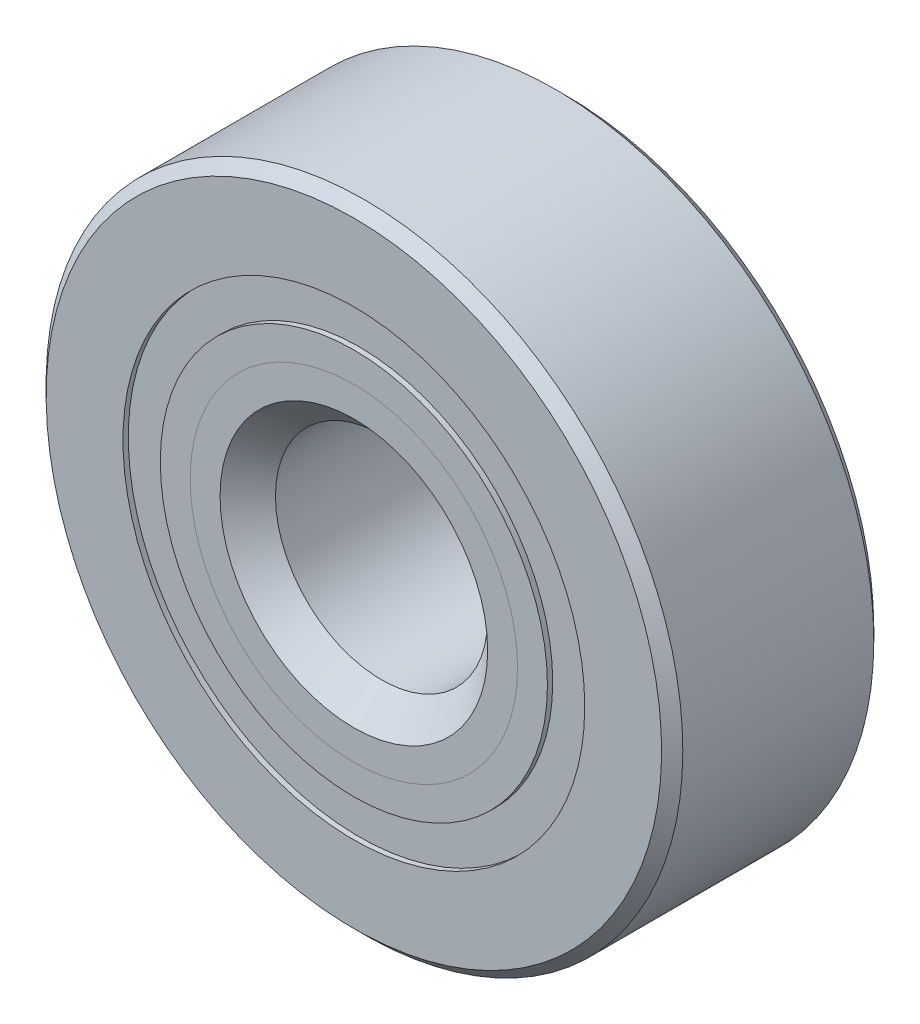
ISO-10303-21;
HEADER;
FILE_DESCRIPTION(('STEP AP214'),'2;1');
FILE_NAME('part.step','',(''),(''),'','','');
FILE_SCHEMA(('AUTOMOTIVE_DESIGN { 1 0 10303 214 1 1 1 1 }'));
ENDSEC;
DATA;
#1=APPLICATION_CONTEXT('core data for automotive mechanical design processes');
#2=APPLICATION_PROTOCOL_DEFINITION('international standard','automotive_design',2000,#1);
#3=PRODUCT_CONTEXT('',#1,'mechanical');
#4=PRODUCT('Part','Part','',(#3));
#5=PRODUCT_RELATED_PRODUCT_CATEGORY('part','',(#4));
#6=PRODUCT_DEFINITION_FORMATION('','',#4);
#7=PRODUCT_DEFINITION_CONTEXT('part definition',#1,'design');
#8=PRODUCT_DEFINITION('design','',#6,#7);
#9=PRODUCT_DEFINITION_SHAPE('','',#8);
#10=(LENGTH_UNIT() NAMED_UNIT(*) SI_UNIT(.MILLI.,.METRE.));
#11=(NAMED_UNIT(*) PLANE_ANGLE_UNIT() SI_UNIT($,.RADIAN.));
#12=(NAMED_UNIT(*) SI_UNIT($,.STERADIAN.) SOLID_ANGLE_UNIT());
#13=UNCERTAINTY_MEASURE_WITH_UNIT(LENGTH_MEASURE(1.E-05),#10,'distance_accuracy_value','');
#14=(GEOMETRIC_REPRESENTATION_CONTEXT(3) GLOBAL_UNCERTAINTY_ASSIGNED_CONTEXT((#13)) GLOBAL_UNIT_ASSIGNED_CONTEXT((#10,
#11,#12)) REPRESENTATION_CONTEXT('',''));
#15=CARTESIAN_POINT('',(0.,0.,0.));
#16=DIRECTION('',(0.,0.,1.));
#17=DIRECTION('',(1.,0.,0.));
#18=AXIS2_PLACEMENT_3D('',#15,#16,#17);
#19=CARTESIAN_POINT('',(0.,-9.525,0.));
#20=DIRECTION('',(0.,-1.,0.));
#21=DIRECTION('',(0.,0.,1.));
#22=AXIS2_PLACEMENT_3D('',#19,#20,#21);
#23=SPHERICAL_SURFACE('',#22,2.27628073054021);
#24=CARTESIAN_POINT('',(0.,-11.8012807305402,0.));
#25=VERTEX_POINT('',#24);
#26=VERTEX_LOOP('',#25);
#27=FACE_BOUND('',#26,.T.);
#28=ADVANCED_FACE('P0_F13',(#27),#23,.T.);
#29=CLOSED_SHELL('',(#28));
#30=MANIFOLD_SOLID_BREP('P0_B1',#29);
#31=CARTESIAN_POINT('',(-8.24889197104682,-4.76249999999992,0.));
#32=DIRECTION('',(-0.866025403784443,-0.499999999999992,0.));
#33=DIRECTION('',(0.,0.,1.));
#34=AXIS2_PLACEMENT_3D('',#31,#32,#33);
#35=SPHERICAL_SURFACE('',#34,2.27628073054022);
#36=CARTESIAN_POINT('',(-10.2202089098397,-5.90064036527001,0.));
#37=VERTEX_POINT('',#36);
#38=VERTEX_LOOP('',#37);
#39=FACE_BOUND('',#38,.T.);
#40=ADVANCED_FACE('P1_F13',(#39),#35,.T.);
#41=CLOSED_SHELL('',(#40));
#42=MANIFOLD_SOLID_BREP('P1_B1',#41);
#43=CARTESIAN_POINT('',(-9.525,0.,0.));
#44=DIRECTION('',(-1.,0.,0.));
#45=DIRECTION('',(0.,0.,-1.));
#46=AXIS2_PLACEMENT_3D('',#43,#44,#45);
#47=SPHERICAL_SURFACE('',#46,2.27628073054021);
#48=CARTESIAN_POINT('',(-11.8012807305402,1.23621584838382E-13,0.));
#49=VERTEX_POINT('',#48);
#50=VERTEX_LOOP('',#49);
#51=FACE_BOUND('',#50,.T.);
#52=ADVANCED_FACE('P2_F13',(#51),#47,.T.);
#53=CLOSED_SHELL('',(#52));
#54=MANIFOLD_SOLID_BREP('P2_B1',#53);
#55=CARTESIAN_POINT('',(0.,0.,4.7625));
#56=DIRECTION('',(0.,0.,1.));
#57=DIRECTION('',(1.,0.,0.));
#58=AXIS2_PLACEMENT_3D('',#55,#56,#57);
#59=CYLINDRICAL_SURFACE('',#58,6.00560963472989);
#60=CARTESIAN_POINT('',(0.,0.,0.));
#61=DIRECTION('',(0.,0.,1.));
#62=DIRECTION('',(1.,0.,0.));
#63=AXIS2_PLACEMENT_3D('',#60,#61,#62);
#64=CIRCLE('',#63,6.00560963472989);
#65=CARTESIAN_POINT('',(6.00560963472989,0.,0.));
#66=VERTEX_POINT('',#65);
#67=EDGE_CURVE('P3_E19',#66,#66,#64,.F.);
#68=ORIENTED_EDGE('',*,*,#67,.T.);
#69=EDGE_LOOP('',(#68));
#70=FACE_BOUND('',#69,.T.);
#71=CARTESIAN_POINT('',(0.,0.,3.42148613604627));
#72=DIRECTION('',(0.,0.,1.));
#73=DIRECTION('',(1.,0.,0.));
#74=AXIS2_PLACEMENT_3D('',#71,#72,#73);
#75=CIRCLE('',#74,6.00560963472989);
#76=CARTESIAN_POINT('',(6.00560963472989,0.,3.42148613604627));
#77=VERTEX_POINT('',#76);
#78=EDGE_CURVE('P3_E32',#77,#77,#75,.T.);
#79=ORIENTED_EDGE('',*,*,#78,.T.);
#80=EDGE_LOOP('',(#79));
#81=FACE_BOUND('',#80,.T.);
#82=ADVANCED_FACE('P3_F15',(#70,#81),#59,.F.);
#83=CARTESIAN_POINT('',(0.,6.00560963472989,0.));
#84=DIRECTION('',(0.,0.,1.));
#85=DIRECTION('',(1.,0.,0.));
#86=AXIS2_PLACEMENT_3D('',#83,#84,#85);
#87=PLANE('',#86);
#88=CARTESIAN_POINT('',(0.,0.,0.));
#89=DIRECTION('',(0.,0.,1.));
#90=DIRECTION('',(1.,0.,0.));
#91=AXIS2_PLACEMENT_3D('',#88,#89,#90);
#92=CIRCLE('',#91,7.24871926945979);
#93=CARTESIAN_POINT('',(7.24871926945979,0.,0.));
#94=VERTEX_POINT('',#93);
#95=EDGE_CURVE('P3_E34',#94,#94,#92,.F.);
#96=ORIENTED_EDGE('',*,*,#95,.T.);
#97=EDGE_LOOP('',(#96));
#98=FACE_BOUND('',#97,.T.);
#99=ORIENTED_EDGE('',*,*,#67,.F.);
#100=EDGE_LOOP('',(#99));
#101=FACE_BOUND('',#100,.T.);
#102=ADVANCED_FACE('P3_F45',(#98,#101),#87,.F.);
#103=CARTESIAN_POINT('',(0.,0.,4.7625));
#104=DIRECTION('',(0.,0.,1.));
#105=DIRECTION('',(1.,0.,0.));
#106=AXIS2_PLACEMENT_3D('',#103,#104,#105);
#107=CONICAL_SURFACE('',#106,7.34662349868363,0.78539816339745);
#108=ORIENTED_EDGE('',*,*,#78,.F.);
#109=EDGE_LOOP('',(#108));
#110=FACE_BOUND('',#109,.T.);
#111=CARTESIAN_POINT('',(0.,0.,4.7625));
#112=DIRECTION('',(0.,0.,1.));
#113=DIRECTION('',(1.,0.,0.));
#114=AXIS2_PLACEMENT_3D('',#111,#112,#113);
#115=CIRCLE('',#114,7.34662349868363);
#116=CARTESIAN_POINT('',(7.34662349868363,0.,4.7625));
#117=VERTEX_POINT('',#116);
#118=EDGE_CURVE('P3_E28',#117,#117,#115,.T.);
#119=ORIENTED_EDGE('',*,*,#118,.T.);
#120=EDGE_LOOP('',(#119));
#121=FACE_BOUND('',#120,.T.);
#122=ADVANCED_FACE('P3_F47',(#110,#121),#107,.F.);
#123=CARTESIAN_POINT('',(0.,0.,0.));
#124=DIRECTION('',(0.,0.,1.));
#125=DIRECTION('',(1.,0.,0.));
#126=AXIS2_PLACEMENT_3D('',#123,#124,#125);
#127=TOROIDAL_SURFACE('',#126,9.525,2.27628073054021);
#128=CARTESIAN_POINT('',(0.,0.,2.11666666666667));
#129=DIRECTION('',(0.,0.,1.));
#130=DIRECTION('',(1.,0.,0.));
#131=AXIS2_PLACEMENT_3D('',#128,#129,#130);
#132=CIRCLE('',#131,8.68763736263736);
#133=CARTESIAN_POINT('',(8.68763736263736,0.,2.11666666666667));
#134=VERTEX_POINT('',#133);
#135=EDGE_CURVE('P3_E23',#134,#134,#132,.T.);
#136=ORIENTED_EDGE('',*,*,#135,.F.);
#137=EDGE_LOOP('',(#136));
#138=FACE_BOUND('',#137,.T.);
#139=ORIENTED_EDGE('',*,*,#95,.F.);
#140=EDGE_LOOP('',(#139));
#141=FACE_BOUND('',#140,.T.);
#142=ADVANCED_FACE('P3_F17',(#138,#141),#127,.F.);
#143=CARTESIAN_POINT('',(0.,8.68763736263736,4.7625));
#144=DIRECTION('',(0.,0.,-1.));
#145=DIRECTION('',(-1.,0.,0.));
#146=AXIS2_PLACEMENT_3D('',#143,#144,#145);
#147=PLANE('',#146);
#148=ORIENTED_EDGE('',*,*,#118,.F.);
#149=EDGE_LOOP('',(#148));
#150=FACE_BOUND('',#149,.T.);
#151=CARTESIAN_POINT('',(0.,0.,4.7625));
#152=DIRECTION('',(0.,0.,1.));
#153=DIRECTION('',(1.,0.,0.));
#154=AXIS2_PLACEMENT_3D('',#151,#152,#153);
#155=CIRCLE('',#154,8.68763736263736);
#156=CARTESIAN_POINT('',(8.68763736263736,0.,4.7625));
#157=VERTEX_POINT('',#156);
#158=EDGE_CURVE('P3_E10',#157,#157,#155,.F.);
#159=ORIENTED_EDGE('',*,*,#158,.F.);
#160=EDGE_LOOP('',(#159));
#161=FACE_BOUND('',#160,.T.);
#162=ADVANCED_FACE('P3_F58',(#150,#161),#147,.F.);
#163=CARTESIAN_POINT('',(0.,0.,4.7625));
#164=DIRECTION('',(0.,0.,1.));
#165=DIRECTION('',(1.,0.,0.));
#166=AXIS2_PLACEMENT_3D('',#163,#164,#165);
#167=CYLINDRICAL_SURFACE('',#166,8.68763736263736);
#168=ORIENTED_EDGE('',*,*,#158,.T.);
#169=EDGE_LOOP('',(#168));
#170=FACE_BOUND('',#169,.T.);
#171=ORIENTED_EDGE('',*,*,#135,.T.);
#172=EDGE_LOOP('',(#171));
#173=FACE_BOUND('',#172,.T.);
#174=ADVANCED_FACE('P3_F56',(#170,#173),#167,.T.);
#175=CLOSED_SHELL('',(#82,#102,#122,#142,#162,#174));
#176=MANIFOLD_SOLID_BREP('P3_B1',#175);
#177=CARTESIAN_POINT('',(0.,0.,0.));
#178=DIRECTION('',(0.,0.,1.));
#179=DIRECTION('',(0.,-1.,0.));
#180=AXIS2_PLACEMENT_3D('',#177,#178,#179);
#181=TOROIDAL_SURFACE('',#180,9.525,2.27628073054022);
#182=CARTESIAN_POINT('',(0.,0.,-2.11666666666667));
#183=DIRECTION('',(0.,0.,1.));
#184=DIRECTION('',(1.,0.,0.));
#185=AXIS2_PLACEMENT_3D('',#182,#183,#184);
#186=CIRCLE('',#185,10.3623626373626);
#187=CARTESIAN_POINT('',(10.3623626373626,0.,-2.11666666666667));
#188=VERTEX_POINT('',#187);
#189=EDGE_CURVE('P4_E33',#188,#188,#186,.F.);
#190=ORIENTED_EDGE('',*,*,#189,.T.);
#191=EDGE_LOOP('',(#190));
#192=FACE_BOUND('',#191,.T.);
#193=CARTESIAN_POINT('',(0.,0.,2.11666666666667));
#194=DIRECTION('',(0.,0.,1.));
#195=DIRECTION('',(1.,0.,0.));
#196=AXIS2_PLACEMENT_3D('',#193,#194,#195);
#197=CIRCLE('',#196,10.3623626373626);
#198=CARTESIAN_POINT('',(10.3623626373626,0.,2.11666666666667));
#199=VERTEX_POINT('',#198);
#200=EDGE_CURVE('P4_E30',#199,#199,#197,.T.);
#201=ORIENTED_EDGE('',*,*,#200,.T.);
#202=EDGE_LOOP('',(#201));
#203=FACE_BOUND('',#202,.T.);
#204=ADVANCED_FACE('P4_F15',(#192,#203),#181,.F.);
#205=CARTESIAN_POINT('',(0.,0.,4.7625));
#206=DIRECTION('',(0.,0.,1.));
#207=DIRECTION('',(1.,0.,0.));
#208=AXIS2_PLACEMENT_3D('',#205,#206,#207);
#209=CYLINDRICAL_SURFACE('',#208,10.3623626373626);
#210=ORIENTED_EDGE('',*,*,#189,.F.);
#211=EDGE_LOOP('',(#210));
#212=FACE_BOUND('',#211,.T.);
#213=CARTESIAN_POINT('',(0.,0.,-4.7625));
#214=DIRECTION('',(0.,0.,1.));
#215=DIRECTION('',(1.,0.,0.));
#216=AXIS2_PLACEMENT_3D('',#213,#214,#215);
#217=CIRCLE('',#216,10.3623626373626);
#218=CARTESIAN_POINT('',(10.3623626373626,0.,-4.7625));
#219=VERTEX_POINT('',#218);
#220=EDGE_CURVE('P4_E18',#219,#219,#217,.F.);
#221=ORIENTED_EDGE('',*,*,#220,.T.);
#222=EDGE_LOOP('',(#221));
#223=FACE_BOUND('',#222,.T.);
#224=ADVANCED_FACE('P4_F47',(#212,#223),#209,.F.);
#225=CARTESIAN_POINT('',(0.,0.,4.7625));
#226=DIRECTION('',(0.,0.,1.));
#227=DIRECTION('',(1.,0.,0.));
#228=AXIS2_PLACEMENT_3D('',#225,#226,#227);
#229=CYLINDRICAL_SURFACE('',#228,10.3623626373626);
#230=ORIENTED_EDGE('',*,*,#200,.F.);
#231=EDGE_LOOP('',(#230));
#232=FACE_BOUND('',#231,.T.);
#233=CARTESIAN_POINT('',(0.,0.,4.7625));
#234=DIRECTION('',(0.,0.,1.));
#235=DIRECTION('',(1.,0.,0.));
#236=AXIS2_PLACEMENT_3D('',#233,#234,#235);
#237=CIRCLE('',#236,10.3623626373626);
#238=CARTESIAN_POINT('',(10.3623626373626,0.,4.7625));
#239=VERTEX_POINT('',#238);
#240=EDGE_CURVE('P4_E40',#239,#239,#237,.T.);
#241=ORIENTED_EDGE('',*,*,#240,.T.);
#242=EDGE_LOOP('',(#241));
#243=FACE_BOUND('',#242,.T.);
#244=ADVANCED_FACE('P4_F52',(#232,#243),#229,.F.);
#245=CARTESIAN_POINT('',(0.,13.81125,-4.7625));
#246=DIRECTION('',(0.,0.,1.));
#247=DIRECTION('',(1.,0.,0.));
#248=AXIS2_PLACEMENT_3D('',#245,#246,#247);
#249=PLANE('',#248);
#250=CARTESIAN_POINT('',(0.,0.,-4.7625));
#251=DIRECTION('',(0.,0.,1.));
#252=DIRECTION('',(1.,0.,0.));
#253=AXIS2_PLACEMENT_3D('',#250,#251,#252);
#254=CIRCLE('',#253,13.81125);
#255=CARTESIAN_POINT('',(13.81125,0.,-4.7625));
#256=VERTEX_POINT('',#255);
#257=EDGE_CURVE('P4_E38',#256,#256,#254,.T.);
#258=ORIENTED_EDGE('',*,*,#257,.F.);
#259=EDGE_LOOP('',(#258));
#260=FACE_BOUND('',#259,.T.);
#261=ORIENTED_EDGE('',*,*,#220,.F.);
#262=EDGE_LOOP('',(#261));
#263=FACE_BOUND('',#262,.T.);
#264=ADVANCED_FACE('P4_F49',(#260,#263),#249,.F.);
#265=CARTESIAN_POINT('',(0.,13.81125,4.7625));
#266=DIRECTION('',(0.,0.,-1.));
#267=DIRECTION('',(-1.,0.,0.));
#268=AXIS2_PLACEMENT_3D('',#265,#266,#267);
#269=PLANE('',#268);
#270=ORIENTED_EDGE('',*,*,#240,.F.);
#271=EDGE_LOOP('',(#270));
#272=FACE_BOUND('',#271,.T.);
#273=CARTESIAN_POINT('',(0.,0.,4.7625));
#274=DIRECTION('',(0.,0.,-1.));
#275=DIRECTION('',(0.,1.,0.));
#276=AXIS2_PLACEMENT_3D('',#273,#274,#275);
#277=CIRCLE('',#276,13.81125);
#278=CARTESIAN_POINT('',(0.,13.81125,4.7625));
#279=VERTEX_POINT('',#278);
#280=EDGE_CURVE('P4_E27',#279,#279,#277,.T.);
#281=ORIENTED_EDGE('',*,*,#280,.F.);
#282=EDGE_LOOP('',(#281));
#283=FACE_BOUND('',#282,.T.);
#284=ADVANCED_FACE('P4_F51',(#272,#283),#269,.F.);
#285=CARTESIAN_POINT('',(0.,0.,-4.28625000000001));
#286=DIRECTION('',(0.,0.,1.));
#287=DIRECTION('',(1.,0.,0.));
#288=AXIS2_PLACEMENT_3D('',#285,#286,#287);
#289=CONICAL_SURFACE('',#288,14.2875,0.785398163397449);
#290=CARTESIAN_POINT('',(0.,0.,-4.28625));
#291=DIRECTION('',(0.,0.,1.));
#292=DIRECTION('',(1.,0.,0.));
#293=AXIS2_PLACEMENT_3D('',#290,#291,#292);
#294=CIRCLE('',#293,14.2875);
#295=CARTESIAN_POINT('',(14.2875,0.,-4.28625));
#296=VERTEX_POINT('',#295);
#297=EDGE_CURVE('P4_E22',#296,#296,#294,.T.);
#298=ORIENTED_EDGE('',*,*,#297,.F.);
#299=EDGE_LOOP('',(#298));
#300=FACE_BOUND('',#299,.T.);
#301=ORIENTED_EDGE('',*,*,#257,.T.);
#302=EDGE_LOOP('',(#301));
#303=FACE_BOUND('',#302,.T.);
#304=ADVANCED_FACE('P4_F60',(#300,#303),#289,.T.);
#305=CARTESIAN_POINT('',(0.,0.,4.28625));
#306=DIRECTION('',(0.,0.,-1.));
#307=DIRECTION('',(0.,1.,0.));
#308=AXIS2_PLACEMENT_3D('',#305,#306,#307);
#309=CONICAL_SURFACE('',#308,14.2875,0.785398163397447);
#310=CARTESIAN_POINT('',(0.,0.,4.28625));
#311=DIRECTION('',(0.,0.,1.));
#312=DIRECTION('',(1.,0.,0.));
#313=AXIS2_PLACEMENT_3D('',#310,#311,#312);
#314=CIRCLE('',#313,14.2875);
#315=CARTESIAN_POINT('',(14.2875,0.,4.28625));
#316=VERTEX_POINT('',#315);
#317=EDGE_CURVE('P4_E10',#316,#316,#314,.F.);
#318=ORIENTED_EDGE('',*,*,#317,.F.);
#319=EDGE_LOOP('',(#318));
#320=FACE_BOUND('',#319,.T.);
#321=ORIENTED_EDGE('',*,*,#280,.T.);
#322=EDGE_LOOP('',(#321));
#323=FACE_BOUND('',#322,.T.);
#324=ADVANCED_FACE('P4_F68',(#320,#323),#309,.T.);
#325=CARTESIAN_POINT('',(0.,0.,4.7625));
#326=DIRECTION('',(0.,0.,1.));
#327=DIRECTION('',(1.,0.,0.));
#328=AXIS2_PLACEMENT_3D('',#325,#326,#327);
#329=CYLINDRICAL_SURFACE('',#328,14.2875);
#330=ORIENTED_EDGE('',*,*,#317,.T.);
#331=EDGE_LOOP('',(#330));
#332=FACE_BOUND('',#331,.T.);
#333=ORIENTED_EDGE('',*,*,#297,.T.);
#334=EDGE_LOOP('',(#333));
#335=FACE_BOUND('',#334,.T.);
#336=ADVANCED_FACE('P4_F66',(#332,#335),#329,.T.);
#337=CLOSED_SHELL('',(#204,#224,#244,#264,#284,#304,#324,#336));
#338=MANIFOLD_SOLID_BREP('P4_B1',#337);
#339=CARTESIAN_POINT('',(0.,10.3623626373626,4.524375));
#340=DIRECTION('',(0.,0.,-1.));
#341=DIRECTION('',(-1.,0.,0.));
#342=AXIS2_PLACEMENT_3D('',#339,#340,#341);
#343=PLANE('',#342);
#344=CARTESIAN_POINT('',(0.,0.,4.524375));
#345=DIRECTION('',(0.,0.,1.));
#346=DIRECTION('',(1.,0.,0.));
#347=AXIS2_PLACEMENT_3D('',#344,#345,#346);
#348=CIRCLE('',#347,8.68763736263736);
#349=CARTESIAN_POINT('',(8.68763736263736,0.,4.524375));
#350=VERTEX_POINT('',#349);
#351=EDGE_CURVE('P5_E18',#350,#350,#348,.F.);
#352=ORIENTED_EDGE('',*,*,#351,.T.);
#353=EDGE_LOOP('',(#352));
#354=FACE_BOUND('',#353,.T.);
#355=CARTESIAN_POINT('',(0.,0.,4.524375));
#356=DIRECTION('',(0.,0.,1.));
#357=DIRECTION('',(1.,0.,0.));
#358=AXIS2_PLACEMENT_3D('',#355,#356,#357);
#359=CIRCLE('',#358,10.3623626373626);
#360=CARTESIAN_POINT('',(10.3623626373626,0.,4.524375));
#361=VERTEX_POINT('',#360);
#362=EDGE_CURVE('P5_E27',#361,#361,#359,.F.);
#363=ORIENTED_EDGE('',*,*,#362,.F.);
#364=EDGE_LOOP('',(#363));
#365=FACE_BOUND('',#364,.T.);
#366=ADVANCED_FACE('P5_F15',(#354,#365),#343,.F.);
#367=CARTESIAN_POINT('',(0.,0.,4.7625));
#368=DIRECTION('',(0.,0.,1.));
#369=DIRECTION('',(1.,0.,0.));
#370=AXIS2_PLACEMENT_3D('',#367,#368,#369);
#371=CYLINDRICAL_SURFACE('',#370,8.68763736263736);
#372=CARTESIAN_POINT('',(0.,0.,2.27628073054021));
#373=DIRECTION('',(0.,0.,1.));
#374=DIRECTION('',(1.,0.,0.));
#375=AXIS2_PLACEMENT_3D('',#372,#373,#374);
#376=CIRCLE('',#375,8.68763736263736);
#377=CARTESIAN_POINT('',(8.68763736263736,0.,2.27628073054021));
#378=VERTEX_POINT('',#377);
#379=EDGE_CURVE('P5_E22',#378,#378,#376,.F.);
#380=ORIENTED_EDGE('',*,*,#379,.T.);
#381=EDGE_LOOP('',(#380));
#382=FACE_BOUND('',#381,.T.);
#383=ORIENTED_EDGE('',*,*,#351,.F.);
#384=EDGE_LOOP('',(#383));
#385=FACE_BOUND('',#384,.T.);
#386=ADVANCED_FACE('P5_F37',(#382,#385),#371,.F.);
#387=CARTESIAN_POINT('',(0.,0.,4.7625));
#388=DIRECTION('',(0.,0.,1.));
#389=DIRECTION('',(1.,0.,0.));
#390=AXIS2_PLACEMENT_3D('',#387,#388,#389);
#391=CYLINDRICAL_SURFACE('',#390,10.3623626373626);
#392=ORIENTED_EDGE('',*,*,#362,.T.);
#393=EDGE_LOOP('',(#392));
#394=FACE_BOUND('',#393,.T.);
#395=CARTESIAN_POINT('',(0.,0.,2.27628073054021));
#396=DIRECTION('',(0.,0.,1.));
#397=DIRECTION('',(1.,0.,0.));
#398=AXIS2_PLACEMENT_3D('',#395,#396,#397);
#399=CIRCLE('',#398,10.3623626373626);
#400=CARTESIAN_POINT('',(10.3623626373626,0.,2.27628073054021));
#401=VERTEX_POINT('',#400);
#402=EDGE_CURVE('P5_E10',#401,#401,#399,.T.);
#403=ORIENTED_EDGE('',*,*,#402,.T.);
#404=EDGE_LOOP('',(#403));
#405=FACE_BOUND('',#404,.T.);
#406=ADVANCED_FACE('P5_F39',(#394,#405),#391,.T.);
#407=CARTESIAN_POINT('',(0.,10.3623626373626,2.27628073054021));
#408=DIRECTION('',(0.,0.,1.));
#409=DIRECTION('',(1.,0.,0.));
#410=AXIS2_PLACEMENT_3D('',#407,#408,#409);
#411=PLANE('',#410);
#412=ORIENTED_EDGE('',*,*,#402,.F.);
#413=EDGE_LOOP('',(#412));
#414=FACE_BOUND('',#413,.T.);
#415=ORIENTED_EDGE('',*,*,#379,.F.);
#416=EDGE_LOOP('',(#415));
#417=FACE_BOUND('',#416,.T.);
#418=ADVANCED_FACE('P5_F46',(#414,#417),#411,.F.);
#419=CLOSED_SHELL('',(#366,#386,#406,#418));
#420=MANIFOLD_SOLID_BREP('P5_B1',#419);
#421=CARTESIAN_POINT('',(-4.76249999999989,8.24889197104684,0.));
#422=DIRECTION('',(-0.499999999999988,0.866025403784445,0.));
#423=DIRECTION('',(0.,0.,1.));
#424=AXIS2_PLACEMENT_3D('',#421,#422,#423);
#425=SPHERICAL_SURFACE('',#424,2.27628073054021);
#426=CARTESIAN_POINT('',(-5.90064036526998,10.2202089098397,0.));
#427=VERTEX_POINT('',#426);
#428=VERTEX_LOOP('',#427);
#429=FACE_BOUND('',#428,.T.);
#430=ADVANCED_FACE('P6_F13',(#429),#425,.T.);
#431=CLOSED_SHELL('',(#430));
#432=MANIFOLD_SOLID_BREP('P6_B1',#431);
#433=CARTESIAN_POINT('',(8.24889197104676,-4.76250000000004,0.));
#434=DIRECTION('',(0.866025403784437,-0.500000000000004,0.));
#435=DIRECTION('',(0.,0.,-1.));
#436=AXIS2_PLACEMENT_3D('',#433,#434,#435);
#437=SPHERICAL_SURFACE('',#436,2.27628073054022);
#438=CARTESIAN_POINT('',(10.2202089098396,-5.90064036527016,0.));
#439=VERTEX_POINT('',#438);
#440=VERTEX_LOOP('',#439);
#441=FACE_BOUND('',#440,.T.);
#442=ADVANCED_FACE('P7_F13',(#441),#437,.T.);
#443=CLOSED_SHELL('',(#442));
#444=MANIFOLD_SOLID_BREP('P7_B1',#443);
#445=CARTESIAN_POINT('',(4.76250000000001,8.24889197104677,0.));
#446=DIRECTION('',(0.500000000000001,0.866025403784438,0.));
#447=DIRECTION('',(0.,0.,-1.));
#448=AXIS2_PLACEMENT_3D('',#445,#446,#447);
#449=SPHERICAL_SURFACE('',#448,2.27628073054021);
#450=CARTESIAN_POINT('',(5.90064036527012,10.2202089098396,0.));
#451=VERTEX_POINT('',#450);
#452=VERTEX_LOOP('',#451);
#453=FACE_BOUND('',#452,.T.);
#454=ADVANCED_FACE('P8_F13',(#453),#449,.T.);
#455=CLOSED_SHELL('',(#454));
#456=MANIFOLD_SOLID_BREP('P8_B1',#455);
#457=CARTESIAN_POINT('',(4.76249999999995,-8.24889197104681,0.));
#458=DIRECTION('',(0.499999999999995,-0.866025403784441,0.));
#459=DIRECTION('',(0.,0.,1.));
#460=AXIS2_PLACEMENT_3D('',#457,#458,#459);
#461=SPHERICAL_SURFACE('',#460,2.27628073054022);
#462=CARTESIAN_POINT('',(5.90064036527005,-10.2202089098396,0.));
#463=VERTEX_POINT('',#462);
#464=VERTEX_LOOP('',#463);
#465=FACE_BOUND('',#464,.T.);
#466=ADVANCED_FACE('P9_F13',(#465),#461,.T.);
#467=CLOSED_SHELL('',(#466));
#468=MANIFOLD_SOLID_BREP('P9_B1',#467);
#469=CARTESIAN_POINT('',(8.24889197104679,4.76249999999998,0.));
#470=DIRECTION('',(0.86602540378444,0.499999999999998,0.));
#471=DIRECTION('',(0.,0.,1.));
#472=AXIS2_PLACEMENT_3D('',#469,#470,#471);
#473=SPHERICAL_SURFACE('',#472,2.27628073054021);
#474=CARTESIAN_POINT('',(10.2202089098396,5.90064036527008,0.));
#475=VERTEX_POINT('',#474);
#476=VERTEX_LOOP('',#475);
#477=FACE_BOUND('',#476,.T.);
#478=ADVANCED_FACE('P10_F13',(#477),#473,.T.);
#479=CLOSED_SHELL('',(#478));
#480=MANIFOLD_SOLID_BREP('P10_B1',#479);
#481=CARTESIAN_POINT('',(9.525,0.,0.));
#482=DIRECTION('',(1.,0.,0.));
#483=DIRECTION('',(0.,0.,-1.));
#484=AXIS2_PLACEMENT_3D('',#481,#482,#483);
#485=SPHERICAL_SURFACE('',#484,2.27628073054021);
#486=CARTESIAN_POINT('',(11.8012807305402,0.,0.));
#487=VERTEX_POINT('',#486);
#488=VERTEX_LOOP('',#487);
#489=FACE_BOUND('',#488,.T.);
#490=ADVANCED_FACE('P11_F13',(#489),#485,.T.);
#491=CLOSED_SHELL('',(#490));
#492=MANIFOLD_SOLID_BREP('P11_B1',#491);
#493=CARTESIAN_POINT('',(0.,0.,4.7624999999698));
#494=DIRECTION('',(0.,0.,1.));
#495=DIRECTION('',(1.,0.,0.));
#496=AXIS2_PLACEMENT_3D('',#493,#494,#495);
#497=CONICAL_SURFACE('',#496,7.34662349861992,0.785398163397448);
#498=CARTESIAN_POINT('',(0.,0.,4.7624999999698));
#499=DIRECTION('',(0.,0.,1.));
#500=DIRECTION('',(1.,0.,0.));
#501=AXIS2_PLACEMENT_3D('',#498,#499,#500);
#502=CIRCLE('',#501,7.34662349861992);
#503=CARTESIAN_POINT('',(7.34662349861992,0.,4.7624999999698));
#504=VERTEX_POINT('',#503);
#505=EDGE_CURVE('P12_E19',#504,#504,#502,.F.);
#506=ORIENTED_EDGE('',*,*,#505,.T.);
#507=EDGE_LOOP('',(#506));
#508=FACE_BOUND('',#507,.T.);
#509=CARTESIAN_POINT('',(0.,0.,3.42148613604627));
#510=DIRECTION('',(0.,0.,1.));
#511=DIRECTION('',(1.,0.,0.));
#512=AXIS2_PLACEMENT_3D('',#509,#510,#511);
#513=CIRCLE('',#512,6.00560963472989);
#514=CARTESIAN_POINT('',(6.00560963472989,0.,3.42148613604627));
#515=VERTEX_POINT('',#514);
#516=EDGE_CURVE('P12_E31',#515,#515,#513,.F.);
#517=ORIENTED_EDGE('',*,*,#516,.F.);
#518=EDGE_LOOP('',(#517));
#519=FACE_BOUND('',#518,.T.);
#520=ADVANCED_FACE('P12_F15',(#508,#519),#497,.T.);
#521=CARTESIAN_POINT('',(0.,7.34662349868363,4.7625));
#522=DIRECTION('',(0.,0.,-1.));
#523=DIRECTION('',(-1.,0.,0.));
#524=AXIS2_PLACEMENT_3D('',#521,#522,#523);
#525=PLANE('',#524);
#526=CARTESIAN_POINT('',(0.,0.,4.76250000008349));
#527=DIRECTION('',(0.,0.,1.));
#528=DIRECTION('',(1.,0.,0.));
#529=AXIS2_PLACEMENT_3D('',#526,#527,#528);
#530=CIRCLE('',#529,6.00560963476937);
#531=CARTESIAN_POINT('',(6.00560963476937,0.,4.76250000008349));
#532=VERTEX_POINT('',#531);
#533=EDGE_CURVE('P12_E41',#532,#532,#530,.F.);
#534=ORIENTED_EDGE('',*,*,#533,.T.);
#535=EDGE_LOOP('',(#534));
#536=FACE_BOUND('',#535,.T.);
#537=ORIENTED_EDGE('',*,*,#505,.F.);
#538=EDGE_LOOP('',(#537));
#539=FACE_BOUND('',#538,.T.);
#540=ADVANCED_FACE('P12_F53',(#536,#539),#525,.F.);
#541=CARTESIAN_POINT('',(0.,0.,4.7625));
#542=DIRECTION('',(0.,0.,1.));
#543=DIRECTION('',(1.,0.,0.));
#544=AXIS2_PLACEMENT_3D('',#541,#542,#543);
#545=CYLINDRICAL_SURFACE('',#544,6.00560963472989);
#546=ORIENTED_EDGE('',*,*,#516,.T.);
#547=EDGE_LOOP('',(#546));
#548=FACE_BOUND('',#547,.T.);
#549=CARTESIAN_POINT('',(0.,0.,0.));
#550=DIRECTION('',(0.,0.,1.));
#551=DIRECTION('',(1.,0.,0.));
#552=AXIS2_PLACEMENT_3D('',#549,#550,#551);
#553=CIRCLE('',#552,6.00560963472989);
#554=CARTESIAN_POINT('',(6.00560963472989,0.,0.));
#555=VERTEX_POINT('',#554);
#556=EDGE_CURVE('P12_E39',#555,#555,#553,.T.);
#557=ORIENTED_EDGE('',*,*,#556,.T.);
#558=EDGE_LOOP('',(#557));
#559=FACE_BOUND('',#558,.T.);
#560=ADVANCED_FACE('P12_F55',(#548,#559),#545,.T.);
#561=CARTESIAN_POINT('',(0.,0.,4.76250000008349));
#562=DIRECTION('',(0.,0.,1.));
#563=DIRECTION('',(1.,0.,0.));
#564=AXIS2_PLACEMENT_3D('',#561,#562,#563);
#565=CONICAL_SURFACE('',#564,6.00560963476937,0.785398163420312);
#566=CARTESIAN_POINT('',(0.,0.,3.51939036527011));
#567=DIRECTION('',(0.,0.,1.));
#568=DIRECTION('',(1.,0.,0.));
#569=AXIS2_PLACEMENT_3D('',#566,#567,#568);
#570=CIRCLE('',#569,4.7625);
#571=CARTESIAN_POINT('',(4.7625,0.,3.51939036527011));
#572=VERTEX_POINT('',#571);
#573=EDGE_CURVE('P12_E38',#572,#572,#570,.F.);
#574=ORIENTED_EDGE('',*,*,#573,.T.);
#575=EDGE_LOOP('',(#574));
#576=FACE_BOUND('',#575,.T.);
#577=ORIENTED_EDGE('',*,*,#533,.F.);
#578=EDGE_LOOP('',(#577));
#579=FACE_BOUND('',#578,.T.);
#580=ADVANCED_FACE('P12_F62',(#576,#579),#565,.F.);
#581=CARTESIAN_POINT('',(0.,6.00560963472989,0.));
#582=DIRECTION('',(0.,0.,-1.));
#583=DIRECTION('',(-1.,0.,0.));
#584=AXIS2_PLACEMENT_3D('',#581,#582,#583);
#585=PLANE('',#584);
#586=ORIENTED_EDGE('',*,*,#556,.F.);
#587=EDGE_LOOP('',(#586));
#588=FACE_BOUND('',#587,.T.);
#589=CARTESIAN_POINT('',(0.,0.,0.));
#590=DIRECTION('',(0.,0.,1.));
#591=DIRECTION('',(1.,0.,0.));
#592=AXIS2_PLACEMENT_3D('',#589,#590,#591);
#593=CIRCLE('',#592,7.24871926945979);
#594=CARTESIAN_POINT('',(7.24871926945979,0.,0.));
#595=VERTEX_POINT('',#594);
#596=EDGE_CURVE('P12_E34',#595,#595,#593,.T.);
#597=ORIENTED_EDGE('',*,*,#596,.T.);
#598=EDGE_LOOP('',(#597));
#599=FACE_BOUND('',#598,.T.);
#600=ADVANCED_FACE('P12_F83',(#588,#599),#585,.F.);
#601=CARTESIAN_POINT('',(0.,0.,4.7625));
#602=DIRECTION('',(0.,0.,1.));
#603=DIRECTION('',(1.,0.,0.));
#604=AXIS2_PLACEMENT_3D('',#601,#602,#603);
#605=CYLINDRICAL_SURFACE('',#604,4.7625);
#606=CARTESIAN_POINT('',(0.,0.,-4.28625000006377));
#607=DIRECTION('',(0.,0.,-1.));
#608=DIRECTION('',(-1.,0.,0.));
#609=AXIS2_PLACEMENT_3D('',#606,#607,#608);
#610=CIRCLE('',#609,4.76250000002665);
#611=CARTESIAN_POINT('',(-4.76250000002665,0.,-4.28625000006377));
#612=VERTEX_POINT('',#611);
#613=EDGE_CURVE('P12_E37',#612,#612,#610,.T.);
#614=ORIENTED_EDGE('',*,*,#613,.T.);
#615=EDGE_LOOP('',(#614));
#616=FACE_BOUND('',#615,.T.);
#617=ORIENTED_EDGE('',*,*,#573,.F.);
#618=EDGE_LOOP('',(#617));
#619=FACE_BOUND('',#618,.T.);
#620=ADVANCED_FACE('P12_F80',(#616,#619),#605,.F.);
#621=CARTESIAN_POINT('',(0.,0.,0.));
#622=DIRECTION('',(0.,0.,1.));
#623=DIRECTION('',(1.,0.,0.));
#624=AXIS2_PLACEMENT_3D('',#621,#622,#623);
#625=TOROIDAL_SURFACE('',#624,9.525,2.27628073054021);
#626=ORIENTED_EDGE('',*,*,#596,.F.);
#627=EDGE_LOOP('',(#626));
#628=FACE_BOUND('',#627,.T.);
#629=CARTESIAN_POINT('',(0.,0.,-2.11666666666667));
#630=DIRECTION('',(0.,0.,1.));
#631=DIRECTION('',(1.,0.,0.));
#632=AXIS2_PLACEMENT_3D('',#629,#630,#631);
#633=CIRCLE('',#632,8.68763736263736);
#634=CARTESIAN_POINT('',(8.68763736263736,0.,-2.11666666666667));
#635=VERTEX_POINT('',#634);
#636=EDGE_CURVE('P12_E28',#635,#635,#633,.F.);
#637=ORIENTED_EDGE('',*,*,#636,.F.);
#638=EDGE_LOOP('',(#637));
#639=FACE_BOUND('',#638,.T.);
#640=ADVANCED_FACE('P12_F17',(#628,#639),#625,.F.);
#641=CARTESIAN_POINT('',(0.,0.,-4.76249999985612));
#642=DIRECTION('',(0.,0.,-1.));
#643=DIRECTION('',(-1.,0.,0.));
#644=AXIS2_PLACEMENT_3D('',#641,#642,#643);
#645=CONICAL_SURFACE('',#644,5.23874999987584,0.785398163457126);
#646=ORIENTED_EDGE('',*,*,#613,.F.);
#647=EDGE_LOOP('',(#646));
#648=FACE_BOUND('',#647,.T.);
#649=CARTESIAN_POINT('',(0.,0.,-4.7624999999698));
#650=DIRECTION('',(0.,0.,-1.));
#651=DIRECTION('',(-1.,0.,0.));
#652=AXIS2_PLACEMENT_3D('',#649,#650,#651);
#653=CIRCLE('',#652,5.23874999998952);
#654=CARTESIAN_POINT('',(-5.23874999998952,0.,-4.7624999999698));
#655=VERTEX_POINT('',#654);
#656=EDGE_CURVE('P12_E23',#655,#655,#653,.T.);
#657=ORIENTED_EDGE('',*,*,#656,.T.);
#658=EDGE_LOOP('',(#657));
#659=FACE_BOUND('',#658,.T.);
#660=ADVANCED_FACE('P12_F72',(#648,#659),#645,.F.);
#661=CARTESIAN_POINT('',(0.,0.,4.7625));
#662=DIRECTION('',(0.,0.,1.));
#663=DIRECTION('',(1.,0.,0.));
#664=AXIS2_PLACEMENT_3D('',#661,#662,#663);
#665=CYLINDRICAL_SURFACE('',#664,8.68763736263736);
#666=ORIENTED_EDGE('',*,*,#636,.T.);
#667=EDGE_LOOP('',(#666));
#668=FACE_BOUND('',#667,.T.);
#669=CARTESIAN_POINT('',(0.,0.,-4.7625));
#670=DIRECTION('',(0.,0.,1.));
#671=DIRECTION('',(1.,0.,0.));
#672=AXIS2_PLACEMENT_3D('',#669,#670,#671);
#673=CIRCLE('',#672,8.68763736263736);
#674=CARTESIAN_POINT('',(8.68763736263736,0.,-4.7625));
#675=VERTEX_POINT('',#674);
#676=EDGE_CURVE('P12_E10',#675,#675,#673,.T.);
#677=ORIENTED_EDGE('',*,*,#676,.T.);
#678=EDGE_LOOP('',(#677));
#679=FACE_BOUND('',#678,.T.);
#680=ADVANCED_FACE('P12_F66',(#668,#679),#665,.T.);
#681=CARTESIAN_POINT('',(0.,5.23875,-4.7625));
#682=DIRECTION('',(0.,0.,1.));
#683=DIRECTION('',(1.,0.,0.));
#684=AXIS2_PLACEMENT_3D('',#681,#682,#683);
#685=PLANE('',#684);
#686=ORIENTED_EDGE('',*,*,#676,.F.);
#687=EDGE_LOOP('',(#686));
#688=FACE_BOUND('',#687,.T.);
#689=ORIENTED_EDGE('',*,*,#656,.F.);
#690=EDGE_LOOP('',(#689));
#691=FACE_BOUND('',#690,.T.);
#692=ADVANCED_FACE('P12_F64',(#688,#691),#685,.F.);
#693=CLOSED_SHELL('',(#520,#540,#560,#580,#600,#620,#640,#660,#680,#692));
#694=MANIFOLD_SOLID_BREP('P12_B1',#693);
#695=CARTESIAN_POINT('',(0.,9.525,0.));
#696=DIRECTION('',(0.,1.,0.));
#697=DIRECTION('',(0.,0.,-1.));
#698=AXIS2_PLACEMENT_3D('',#695,#696,#697);
#699=SPHERICAL_SURFACE('',#698,2.27628073054021);
#700=CARTESIAN_POINT('',(0.,11.8012807305402,0.));
#701=VERTEX_POINT('',#700);
#702=VERTEX_LOOP('',#701);
#703=FACE_BOUND('',#702,.T.);
#704=ADVANCED_FACE('P13_F13',(#703),#699,.T.);
#705=CLOSED_SHELL('',(#704));
#706=MANIFOLD_SOLID_BREP('P13_B1',#705);
#707=CARTESIAN_POINT('',(-8.24889197104672,4.7625000000001,0.));
#708=DIRECTION('',(-0.866025403784433,0.50000000000001,0.));
#709=DIRECTION('',(0.,0.,1.));
#710=AXIS2_PLACEMENT_3D('',#707,#708,#709);
#711=SPHERICAL_SURFACE('',#710,2.27628073054021);
#712=CARTESIAN_POINT('',(-10.2202089098395,5.90064036527023,0.));
#713=VERTEX_POINT('',#712);
#714=VERTEX_LOOP('',#713);
#715=FACE_BOUND('',#714,.T.);
#716=ADVANCED_FACE('P14_F13',(#715),#711,.T.);
#717=CLOSED_SHELL('',(#716));
#718=MANIFOLD_SOLID_BREP('P14_B1',#717);
#719=CARTESIAN_POINT('',(-4.76250000000007,-8.24889197104674,0.));
#720=DIRECTION('',(-0.500000000000008,-0.866025403784434,0.));
#721=DIRECTION('',(0.,0.,-1.));
#722=AXIS2_PLACEMENT_3D('',#719,#720,#721);
#723=SPHERICAL_SURFACE('',#722,2.27628073054021);
#724=CARTESIAN_POINT('',(-5.90064036527019,-10.2202089098396,0.));
#725=VERTEX_POINT('',#724);
#726=VERTEX_LOOP('',#725);
#727=FACE_BOUND('',#726,.T.);
#728=ADVANCED_FACE('P15_F13',(#727),#723,.T.);
#729=CLOSED_SHELL('',(#728));
#730=MANIFOLD_SOLID_BREP('P15_B1',#729);
#731=CARTESIAN_POINT('',(0.,10.3623626373626,-2.27628073054022));
#732=DIRECTION('',(0.,0.,-1.));
#733=DIRECTION('',(-1.,0.,0.));
#734=AXIS2_PLACEMENT_3D('',#731,#732,#733);
#735=PLANE('',#734);
#736=CARTESIAN_POINT('',(0.,0.,-2.27628073054022));
#737=DIRECTION('',(0.,0.,1.));
#738=DIRECTION('',(1.,0.,0.));
#739=AXIS2_PLACEMENT_3D('',#736,#737,#738);
#740=CIRCLE('',#739,8.68763736263737);
#741=CARTESIAN_POINT('',(8.68763736263737,0.,-2.27628073054022));
#742=VERTEX_POINT('',#741);
#743=EDGE_CURVE('P16_E18',#742,#742,#740,.F.);
#744=ORIENTED_EDGE('',*,*,#743,.T.);
#745=EDGE_LOOP('',(#744));
#746=FACE_BOUND('',#745,.T.);
#747=CARTESIAN_POINT('',(0.,0.,-2.27628073054022));
#748=DIRECTION('',(0.,0.,1.));
#749=DIRECTION('',(1.,0.,0.));
#750=AXIS2_PLACEMENT_3D('',#747,#748,#749);
#751=CIRCLE('',#750,10.3623626373626);
#752=CARTESIAN_POINT('',(10.3623626373626,0.,-2.27628073054022));
#753=VERTEX_POINT('',#752);
#754=EDGE_CURVE('P16_E27',#753,#753,#751,.F.);
#755=ORIENTED_EDGE('',*,*,#754,.F.);
#756=EDGE_LOOP('',(#755));
#757=FACE_BOUND('',#756,.T.);
#758=ADVANCED_FACE('P16_F15',(#746,#757),#735,.F.);
#759=CARTESIAN_POINT('',(0.,0.,4.7625));
#760=DIRECTION('',(0.,0.,1.));
#761=DIRECTION('',(1.,0.,0.));
#762=AXIS2_PLACEMENT_3D('',#759,#760,#761);
#763=CYLINDRICAL_SURFACE('',#762,8.68763736263737);
#764=CARTESIAN_POINT('',(0.,0.,-4.524375));
#765=DIRECTION('',(0.,0.,1.));
#766=DIRECTION('',(1.,0.,0.));
#767=AXIS2_PLACEMENT_3D('',#764,#765,#766);
#768=CIRCLE('',#767,8.68763736263737);
#769=CARTESIAN_POINT('',(8.68763736263737,0.,-4.524375));
#770=VERTEX_POINT('',#769);
#771=EDGE_CURVE('P16_E22',#770,#770,#768,.F.);
#772=ORIENTED_EDGE('',*,*,#771,.T.);
#773=EDGE_LOOP('',(#772));
#774=FACE_BOUND('',#773,.T.);
#775=ORIENTED_EDGE('',*,*,#743,.F.);
#776=EDGE_LOOP('',(#775));
#777=FACE_BOUND('',#776,.T.);
#778=ADVANCED_FACE('P16_F37',(#774,#777),#763,.F.);
#779=CARTESIAN_POINT('',(0.,0.,4.7625));
#780=DIRECTION('',(0.,0.,1.));
#781=DIRECTION('',(1.,0.,0.));
#782=AXIS2_PLACEMENT_3D('',#779,#780,#781);
#783=CYLINDRICAL_SURFACE('',#782,10.3623626373626);
#784=ORIENTED_EDGE('',*,*,#754,.T.);
#785=EDGE_LOOP('',(#784));
#786=FACE_BOUND('',#785,.T.);
#787=CARTESIAN_POINT('',(0.,0.,-4.524375));
#788=DIRECTION('',(0.,0.,1.));
#789=DIRECTION('',(1.,0.,0.));
#790=AXIS2_PLACEMENT_3D('',#787,#788,#789);
#791=CIRCLE('',#790,10.3623626373626);
#792=CARTESIAN_POINT('',(10.3623626373626,0.,-4.524375));
#793=VERTEX_POINT('',#792);
#794=EDGE_CURVE('P16_E10',#793,#793,#791,.T.);
#795=ORIENTED_EDGE('',*,*,#794,.T.);
#796=EDGE_LOOP('',(#795));
#797=FACE_BOUND('',#796,.T.);
#798=ADVANCED_FACE('P16_F39',(#786,#797),#783,.T.);
#799=CARTESIAN_POINT('',(0.,10.3623626373626,-4.524375));
#800=DIRECTION('',(0.,0.,1.));
#801=DIRECTION('',(1.,0.,0.));
#802=AXIS2_PLACEMENT_3D('',#799,#800,#801);
#803=PLANE('',#802);
#804=ORIENTED_EDGE('',*,*,#794,.F.);
#805=EDGE_LOOP('',(#804));
#806=FACE_BOUND('',#805,.T.);
#807=ORIENTED_EDGE('',*,*,#771,.F.);
#808=EDGE_LOOP('',(#807));
#809=FACE_BOUND('',#808,.T.);
#810=ADVANCED_FACE('P16_F46',(#806,#809),#803,.F.);
#811=CLOSED_SHELL('',(#758,#778,#798,#810));
#812=MANIFOLD_SOLID_BREP('P16_B1',#811);
#813=ADVANCED_BREP_SHAPE_REPRESENTATION('',(#18,#30,#42,#54,#176,#338,#420,#432,#444,#456,#468,
#480,#492,#694,#706,#718,#730,#812),#14);
#814=SHAPE_DEFINITION_REPRESENTATION(#9,#813);
ENDSEC;
END-ISO-10303-21;
